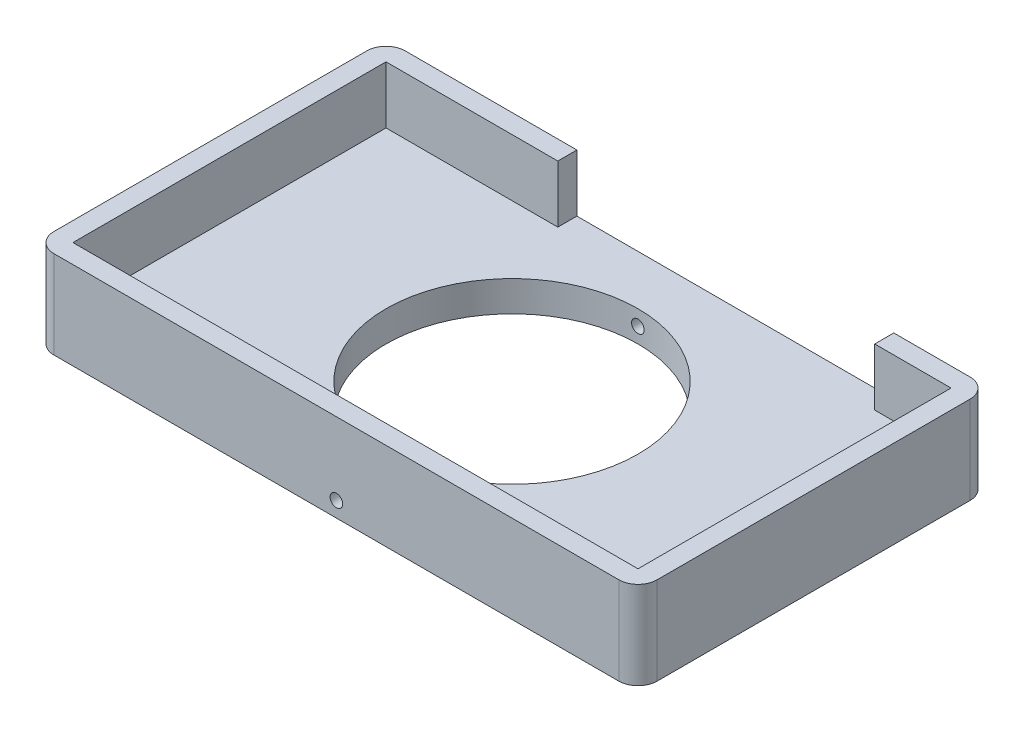
ISO-10303-21;
HEADER;
FILE_DESCRIPTION(('STEP AP214'),'2;1');
FILE_NAME('part.step','',(''),(''),'','','');
FILE_SCHEMA(('AUTOMOTIVE_DESIGN { 1 0 10303 214 1 1 1 1 }'));
ENDSEC;
DATA;
#1=APPLICATION_CONTEXT('core data for automotive mechanical design processes');
#2=APPLICATION_PROTOCOL_DEFINITION('international standard','automotive_design',2000,#1);
#3=PRODUCT_CONTEXT('',#1,'mechanical');
#4=PRODUCT('Part','Part','',(#3));
#5=PRODUCT_RELATED_PRODUCT_CATEGORY('part','',(#4));
#6=PRODUCT_DEFINITION_FORMATION('','',#4);
#7=PRODUCT_DEFINITION_CONTEXT('part definition',#1,'design');
#8=PRODUCT_DEFINITION('design','',#6,#7);
#9=PRODUCT_DEFINITION_SHAPE('','',#8);
#10=(LENGTH_UNIT() NAMED_UNIT(*) SI_UNIT(.MILLI.,.METRE.));
#11=(NAMED_UNIT(*) PLANE_ANGLE_UNIT() SI_UNIT($,.RADIAN.));
#12=(NAMED_UNIT(*) SI_UNIT($,.STERADIAN.) SOLID_ANGLE_UNIT());
#13=UNCERTAINTY_MEASURE_WITH_UNIT(LENGTH_MEASURE(1.E-05),#10,'distance_accuracy_value','');
#14=(GEOMETRIC_REPRESENTATION_CONTEXT(3) GLOBAL_UNCERTAINTY_ASSIGNED_CONTEXT((#13)) GLOBAL_UNIT_ASSIGNED_CONTEXT((#10,
#11,#12)) REPRESENTATION_CONTEXT('',''));
#15=CARTESIAN_POINT('',(0.,0.,0.));
#16=DIRECTION('',(0.,0.,1.));
#17=DIRECTION('',(1.,0.,0.));
#18=AXIS2_PLACEMENT_3D('',#15,#16,#17);
#19=CARTESIAN_POINT('',(-78.9999999999999,8.,46.));
#20=DIRECTION('',(0.,0.,-1.));
#21=DIRECTION('',(-1.,0.,0.));
#22=AXIS2_PLACEMENT_3D('',#19,#20,#21);
#23=PLANE('',#22);
#24=CARTESIAN_POINT('',(0.,4.,46.));
#25=DIRECTION('',(0.,0.,1.));
#26=DIRECTION('',(1.,0.,0.));
#27=AXIS2_PLACEMENT_3D('',#24,#25,#26);
#28=CIRCLE('',#27,1.64999999999999);
#29=CARTESIAN_POINT('',(1.64999999999999,4.,46.));
#30=VERTEX_POINT('',#29);
#31=EDGE_CURVE('E382',#30,#30,#28,.T.);
#32=ORIENTED_EDGE('',*,*,#31,.F.);
#33=EDGE_LOOP('',(#32));
#34=FACE_BOUND('',#33,.T.);
#35=DIRECTION('',(1.,0.,0.));
#36=VECTOR('',#35,1.);
#37=CARTESIAN_POINT('',(-79.,23.,46.));
#38=LINE('',#37,#36);
#39=CARTESIAN_POINT('',(-73.9999999999999,23.,46.));
#40=VERTEX_POINT('',#39);
#41=CARTESIAN_POINT('',(74.0000000000001,23.,46.));
#42=VERTEX_POINT('',#41);
#43=EDGE_CURVE('E11',#40,#42,#38,.T.);
#44=ORIENTED_EDGE('',*,*,#43,.F.);
#45=DIRECTION('',(0.,-1.,0.));
#46=VECTOR('',#45,1.);
#47=CARTESIAN_POINT('',(-73.9999999999999,8.,46.));
#48=LINE('',#47,#46);
#49=CARTESIAN_POINT('',(-73.9999999999999,0.,46.));
#50=VERTEX_POINT('',#49);
#51=EDGE_CURVE('E224',#40,#50,#48,.T.);
#52=ORIENTED_EDGE('',*,*,#51,.T.);
#53=DIRECTION('',(1.,0.,0.));
#54=VECTOR('',#53,1.);
#55=CARTESIAN_POINT('',(-78.9999999999999,0.,46.));
#56=LINE('',#55,#54);
#57=CARTESIAN_POINT('',(74.,0.,46.));
#58=VERTEX_POINT('',#57);
#59=EDGE_CURVE('E269',#50,#58,#56,.T.);
#60=ORIENTED_EDGE('',*,*,#59,.T.);
#61=DIRECTION('',(0.,-1.,0.));
#62=VECTOR('',#61,1.);
#63=CARTESIAN_POINT('',(74.,8.,46.));
#64=LINE('',#63,#62);
#65=EDGE_CURVE('E258',#58,#42,#64,.F.);
#66=ORIENTED_EDGE('',*,*,#65,.T.);
#67=EDGE_LOOP('',(#44,#52,#60,#66));
#68=FACE_BOUND('',#67,.T.);
#69=ADVANCED_FACE('F37',(#34,#68),#23,.F.);
#70=CARTESIAN_POINT('',(0.,23.,0.));
#71=DIRECTION('',(0.,1.,0.));
#72=DIRECTION('',(0.,0.,1.));
#73=AXIS2_PLACEMENT_3D('',#70,#71,#72);
#74=PLANE('',#73);
#75=DIRECTION('',(1.,0.,0.));
#76=VECTOR('',#75,1.);
#77=CARTESIAN_POINT('',(-74.,23.,41.));
#78=LINE('',#77,#76);
#79=CARTESIAN_POINT('',(-74.,23.,41.));
#80=VERTEX_POINT('',#79);
#81=CARTESIAN_POINT('',(74.,23.,41.));
#82=VERTEX_POINT('',#81);
#83=EDGE_CURVE('E49',#80,#82,#78,.T.);
#84=ORIENTED_EDGE('',*,*,#83,.F.);
#85=DIRECTION('',(0.,0.,1.));
#86=VECTOR('',#85,1.);
#87=CARTESIAN_POINT('',(-74.,23.,-41.));
#88=LINE('',#87,#86);
#89=CARTESIAN_POINT('',(-74.,23.,-41.));
#90=VERTEX_POINT('',#89);
#91=EDGE_CURVE('E237',#90,#80,#88,.T.);
#92=ORIENTED_EDGE('',*,*,#91,.F.);
#93=DIRECTION('',(-1.,0.,0.));
#94=VECTOR('',#93,1.);
#95=CARTESIAN_POINT('',(-74.,23.,-41.));
#96=LINE('',#95,#94);
#97=CARTESIAN_POINT('',(-29.,23.,-41.));
#98=VERTEX_POINT('',#97);
#99=EDGE_CURVE('E240',#98,#90,#96,.T.);
#100=ORIENTED_EDGE('',*,*,#99,.F.);
#101=DIRECTION('',(0.,0.,-1.));
#102=VECTOR('',#101,1.);
#103=CARTESIAN_POINT('',(-29.,23.,0.));
#104=LINE('',#103,#102);
#105=CARTESIAN_POINT('',(-29.,23.,-46.));
#106=VERTEX_POINT('',#105);
#107=EDGE_CURVE('E215',#98,#106,#104,.T.);
#108=ORIENTED_EDGE('',*,*,#107,.T.);
#109=DIRECTION('',(-1.,0.,0.));
#110=VECTOR('',#109,1.);
#111=CARTESIAN_POINT('',(-79.,23.,-46.));
#112=LINE('',#111,#110);
#113=CARTESIAN_POINT('',(-74.,23.,-46.));
#114=VERTEX_POINT('',#113);
#115=EDGE_CURVE('E230',#106,#114,#112,.T.);
#116=ORIENTED_EDGE('',*,*,#115,.T.);
#117=CARTESIAN_POINT('',(-74.,23.,-41.));
#118=DIRECTION('',(0.,1.,0.));
#119=DIRECTION('',(0.,0.,1.));
#120=AXIS2_PLACEMENT_3D('',#117,#118,#119);
#121=CIRCLE('',#120,5.);
#122=CARTESIAN_POINT('',(-79.,23.,-41.));
#123=VERTEX_POINT('',#122);
#124=EDGE_CURVE('E218',#114,#123,#121,.T.);
#125=ORIENTED_EDGE('',*,*,#124,.T.);
#126=DIRECTION('',(0.,0.,1.));
#127=VECTOR('',#126,1.);
#128=CARTESIAN_POINT('',(-79.,23.,-46.));
#129=LINE('',#128,#127);
#130=CARTESIAN_POINT('',(-79.,23.,41.));
#131=VERTEX_POINT('',#130);
#132=EDGE_CURVE('E227',#123,#131,#129,.T.);
#133=ORIENTED_EDGE('',*,*,#132,.T.);
#134=CARTESIAN_POINT('',(-73.9999999999999,23.,41.));
#135=DIRECTION('',(0.,1.,0.));
#136=DIRECTION('',(0.,0.,1.));
#137=AXIS2_PLACEMENT_3D('',#134,#135,#136);
#138=CIRCLE('',#137,5.);
#139=EDGE_CURVE('E220',#131,#40,#138,.T.);
#140=ORIENTED_EDGE('',*,*,#139,.T.);
#141=ORIENTED_EDGE('',*,*,#43,.T.);
#142=CARTESIAN_POINT('',(74.,23.,41.));
#143=DIRECTION('',(0.,1.,0.));
#144=DIRECTION('',(0.,0.,1.));
#145=AXIS2_PLACEMENT_3D('',#142,#143,#144);
#146=CIRCLE('',#145,5.);
#147=CARTESIAN_POINT('',(79.,23.,41.));
#148=VERTEX_POINT('',#147);
#149=EDGE_CURVE('E173',#42,#148,#146,.T.);
#150=ORIENTED_EDGE('',*,*,#149,.T.);
#151=DIRECTION('',(0.,0.,-1.));
#152=VECTOR('',#151,1.);
#153=CARTESIAN_POINT('',(79.,23.,-46.));
#154=LINE('',#153,#152);
#155=CARTESIAN_POINT('',(79.,23.,-41.));
#156=VERTEX_POINT('',#155);
#157=EDGE_CURVE('E190',#148,#156,#154,.T.);
#158=ORIENTED_EDGE('',*,*,#157,.T.);
#159=CARTESIAN_POINT('',(74.,23.,-41.));
#160=DIRECTION('',(0.,1.,0.));
#161=DIRECTION('',(0.,0.,1.));
#162=AXIS2_PLACEMENT_3D('',#159,#160,#161);
#163=CIRCLE('',#162,5.);
#164=CARTESIAN_POINT('',(74.,23.,-46.));
#165=VERTEX_POINT('',#164);
#166=EDGE_CURVE('E193',#156,#165,#163,.T.);
#167=ORIENTED_EDGE('',*,*,#166,.T.);
#168=DIRECTION('',(-1.,0.,0.));
#169=VECTOR('',#168,1.);
#170=CARTESIAN_POINT('',(-79.,23.,-46.));
#171=LINE('',#170,#169);
#172=CARTESIAN_POINT('',(54.,23.,-46.));
#173=VERTEX_POINT('',#172);
#174=EDGE_CURVE('E187',#165,#173,#171,.T.);
#175=ORIENTED_EDGE('',*,*,#174,.T.);
#176=DIRECTION('',(0.,0.,-1.));
#177=VECTOR('',#176,1.);
#178=CARTESIAN_POINT('',(54.,23.,0.));
#179=LINE('',#178,#177);
#180=CARTESIAN_POINT('',(54.,23.,-41.));
#181=VERTEX_POINT('',#180);
#182=EDGE_CURVE('E178',#181,#173,#179,.T.);
#183=ORIENTED_EDGE('',*,*,#182,.F.);
#184=DIRECTION('',(-1.,0.,0.));
#185=VECTOR('',#184,1.);
#186=CARTESIAN_POINT('',(-74.,23.,-41.));
#187=LINE('',#186,#185);
#188=CARTESIAN_POINT('',(74.,23.,-41.));
#189=VERTEX_POINT('',#188);
#190=EDGE_CURVE('E170',#189,#181,#187,.T.);
#191=ORIENTED_EDGE('',*,*,#190,.F.);
#192=DIRECTION('',(0.,0.,-1.));
#193=VECTOR('',#192,1.);
#194=CARTESIAN_POINT('',(74.,23.,-41.));
#195=LINE('',#194,#193);
#196=EDGE_CURVE('E157',#82,#189,#195,.T.);
#197=ORIENTED_EDGE('',*,*,#196,.F.);
#198=EDGE_LOOP('',(#84,#92,#100,#108,#116,#125,#133,#140,#141,#150,#158,#167,#175,#183,#191,#197));
#199=FACE_BOUND('',#198,.T.);
#200=ADVANCED_FACE('F175',(#199),#74,.T.);
#201=CARTESIAN_POINT('',(-74.,23.,41.));
#202=DIRECTION('',(0.,0.,-1.));
#203=DIRECTION('',(-1.,0.,0.));
#204=AXIS2_PLACEMENT_3D('',#201,#202,#203);
#205=PLANE('',#204);
#206=DIRECTION('',(0.,-1.,0.));
#207=VECTOR('',#206,1.);
#208=CARTESIAN_POINT('',(74.,23.,41.));
#209=LINE('',#208,#207);
#210=CARTESIAN_POINT('',(74.,8.,41.));
#211=VERTEX_POINT('',#210);
#212=EDGE_CURVE('E164',#82,#211,#209,.T.);
#213=ORIENTED_EDGE('',*,*,#212,.T.);
#214=DIRECTION('',(1.,0.,0.));
#215=VECTOR('',#214,1.);
#216=CARTESIAN_POINT('',(-74.,8.,41.));
#217=LINE('',#216,#215);
#218=CARTESIAN_POINT('',(-74.,8.,41.));
#219=VERTEX_POINT('',#218);
#220=EDGE_CURVE('E203',#219,#211,#217,.T.);
#221=ORIENTED_EDGE('',*,*,#220,.F.);
#222=DIRECTION('',(0.,-1.,0.));
#223=VECTOR('',#222,1.);
#224=CARTESIAN_POINT('',(-74.,23.,41.));
#225=LINE('',#224,#223);
#226=EDGE_CURVE('E234',#80,#219,#225,.T.);
#227=ORIENTED_EDGE('',*,*,#226,.F.);
#228=ORIENTED_EDGE('',*,*,#83,.T.);
#229=EDGE_LOOP('',(#213,#221,#227,#228));
#230=FACE_BOUND('',#229,.T.);
#231=ADVANCED_FACE('F330',(#230),#205,.T.);
#232=CARTESIAN_POINT('',(74.,8.,-41.));
#233=DIRECTION('',(0.,1.,0.));
#234=DIRECTION('',(0.,0.,1.));
#235=AXIS2_PLACEMENT_3D('',#232,#233,#234);
#236=PLANE('',#235);
#237=DIRECTION('',(0.,0.,1.));
#238=VECTOR('',#237,1.);
#239=CARTESIAN_POINT('',(-29.,8.,46.01));
#240=LINE('',#239,#238);
#241=CARTESIAN_POINT('',(-29.,8.,-46.));
#242=VERTEX_POINT('',#241);
#243=CARTESIAN_POINT('',(-29.,8.,-41.));
#244=VERTEX_POINT('',#243);
#245=EDGE_CURVE('E250',#242,#244,#240,.T.);
#246=ORIENTED_EDGE('',*,*,#245,.T.);
#247=DIRECTION('',(-1.,0.,0.));
#248=VECTOR('',#247,1.);
#249=CARTESIAN_POINT('',(-74.,8.,-41.));
#250=LINE('',#249,#248);
#251=CARTESIAN_POINT('',(-74.,8.,-41.));
#252=VERTEX_POINT('',#251);
#253=EDGE_CURVE('E207',#244,#252,#250,.T.);
#254=ORIENTED_EDGE('',*,*,#253,.T.);
#255=DIRECTION('',(0.,0.,1.));
#256=VECTOR('',#255,1.);
#257=CARTESIAN_POINT('',(-74.,8.,-41.));
#258=LINE('',#257,#256);
#259=EDGE_CURVE('E204',#252,#219,#258,.T.);
#260=ORIENTED_EDGE('',*,*,#259,.T.);
#261=ORIENTED_EDGE('',*,*,#220,.T.);
#262=DIRECTION('',(0.,0.,-1.));
#263=VECTOR('',#262,1.);
#264=CARTESIAN_POINT('',(74.,8.,-41.));
#265=LINE('',#264,#263);
#266=CARTESIAN_POINT('',(74.,8.,-41.));
#267=VERTEX_POINT('',#266);
#268=EDGE_CURVE('E275',#211,#267,#265,.T.);
#269=ORIENTED_EDGE('',*,*,#268,.T.);
#270=DIRECTION('',(-1.,0.,0.));
#271=VECTOR('',#270,1.);
#272=CARTESIAN_POINT('',(-74.,8.,-41.));
#273=LINE('',#272,#271);
#274=CARTESIAN_POINT('',(54.,8.,-41.));
#275=VERTEX_POINT('',#274);
#276=EDGE_CURVE('E172',#267,#275,#273,.T.);
#277=ORIENTED_EDGE('',*,*,#276,.T.);
#278=DIRECTION('',(0.,0.,1.));
#279=VECTOR('',#278,1.);
#280=CARTESIAN_POINT('',(54.,8.,46.01));
#281=LINE('',#280,#279);
#282=CARTESIAN_POINT('',(54.,8.,-46.));
#283=VERTEX_POINT('',#282);
#284=EDGE_CURVE('E167',#283,#275,#281,.T.);
#285=ORIENTED_EDGE('',*,*,#284,.F.);
#286=DIRECTION('',(-1.,0.,0.));
#287=VECTOR('',#286,1.);
#288=CARTESIAN_POINT('',(-79.,8.,-46.));
#289=LINE('',#288,#287);
#290=EDGE_CURVE('E252',#283,#242,#289,.T.);
#291=ORIENTED_EDGE('',*,*,#290,.T.);
#292=EDGE_LOOP('',(#246,#254,#260,#261,#269,#277,#285,#291));
#293=FACE_BOUND('',#292,.T.);
#294=CARTESIAN_POINT('',(0.,8.,0.));
#295=DIRECTION('',(0.,1.,0.));
#296=DIRECTION('',(0.,0.,1.));
#297=AXIS2_PLACEMENT_3D('',#294,#295,#296);
#298=CIRCLE('',#297,33.);
#299=CARTESIAN_POINT('',(0.,8.,33.));
#300=VERTEX_POINT('',#299);
#301=EDGE_CURVE('E244',#300,#300,#298,.T.);
#302=ORIENTED_EDGE('',*,*,#301,.F.);
#303=EDGE_LOOP('',(#302));
#304=FACE_BOUND('',#303,.T.);
#305=ADVANCED_FACE('F332',(#293,#304),#236,.T.);
#306=CARTESIAN_POINT('',(0.,0.,0.));
#307=DIRECTION('',(0.,1.,0.));
#308=DIRECTION('',(0.,0.,1.));
#309=AXIS2_PLACEMENT_3D('',#306,#307,#308);
#310=PLANE('',#309);
#311=ORIENTED_EDGE('',*,*,#59,.F.);
#312=CARTESIAN_POINT('',(-73.9999999999999,0.,41.));
#313=DIRECTION('',(0.,1.,0.));
#314=DIRECTION('',(0.,0.,1.));
#315=AXIS2_PLACEMENT_3D('',#312,#313,#314);
#316=CIRCLE('',#315,5.);
#317=CARTESIAN_POINT('',(-78.9999999999999,0.,41.));
#318=VERTEX_POINT('',#317);
#319=EDGE_CURVE('E182',#50,#318,#316,.F.);
#320=ORIENTED_EDGE('',*,*,#319,.T.);
#321=DIRECTION('',(0.,0.,1.));
#322=VECTOR('',#321,1.);
#323=CARTESIAN_POINT('',(-79.,0.,-46.));
#324=LINE('',#323,#322);
#325=CARTESIAN_POINT('',(-79.,0.,-41.));
#326=VERTEX_POINT('',#325);
#327=EDGE_CURVE('E200',#326,#318,#324,.T.);
#328=ORIENTED_EDGE('',*,*,#327,.F.);
#329=CARTESIAN_POINT('',(-74.,0.,-41.));
#330=DIRECTION('',(0.,1.,0.));
#331=DIRECTION('',(0.,0.,1.));
#332=AXIS2_PLACEMENT_3D('',#329,#330,#331);
#333=CIRCLE('',#332,5.);
#334=CARTESIAN_POINT('',(-74.,0.,-46.));
#335=VERTEX_POINT('',#334);
#336=EDGE_CURVE('E179',#326,#335,#333,.F.);
#337=ORIENTED_EDGE('',*,*,#336,.T.);
#338=DIRECTION('',(-1.,0.,0.));
#339=VECTOR('',#338,1.);
#340=CARTESIAN_POINT('',(-79.,0.,-46.));
#341=LINE('',#340,#339);
#342=CARTESIAN_POINT('',(74.,0.,-46.));
#343=VERTEX_POINT('',#342);
#344=EDGE_CURVE('E270',#343,#335,#341,.T.);
#345=ORIENTED_EDGE('',*,*,#344,.F.);
#346=CARTESIAN_POINT('',(74.,0.,-41.));
#347=DIRECTION('',(0.,1.,0.));
#348=DIRECTION('',(0.,0.,1.));
#349=AXIS2_PLACEMENT_3D('',#346,#347,#348);
#350=CIRCLE('',#349,5.);
#351=CARTESIAN_POINT('',(79.,0.,-41.));
#352=VERTEX_POINT('',#351);
#353=EDGE_CURVE('E265',#343,#352,#350,.F.);
#354=ORIENTED_EDGE('',*,*,#353,.T.);
#355=DIRECTION('',(0.,0.,-1.));
#356=VECTOR('',#355,1.);
#357=CARTESIAN_POINT('',(79.,0.,-46.));
#358=LINE('',#357,#356);
#359=CARTESIAN_POINT('',(79.,0.,41.));
#360=VERTEX_POINT('',#359);
#361=EDGE_CURVE('E272',#360,#352,#358,.T.);
#362=ORIENTED_EDGE('',*,*,#361,.F.);
#363=CARTESIAN_POINT('',(74.,0.,41.));
#364=DIRECTION('',(0.,1.,0.));
#365=DIRECTION('',(0.,0.,1.));
#366=AXIS2_PLACEMENT_3D('',#363,#364,#365);
#367=CIRCLE('',#366,5.);
#368=EDGE_CURVE('E261',#360,#58,#367,.F.);
#369=ORIENTED_EDGE('',*,*,#368,.T.);
#370=EDGE_LOOP('',(#311,#320,#328,#337,#345,#354,#362,#369));
#371=FACE_BOUND('',#370,.T.);
#372=CARTESIAN_POINT('',(0.,0.,0.));
#373=DIRECTION('',(0.,-1.,0.));
#374=DIRECTION('',(0.,0.,-1.));
#375=AXIS2_PLACEMENT_3D('',#372,#373,#374);
#376=CIRCLE('',#375,33.);
#377=CARTESIAN_POINT('',(0.,0.,-33.));
#378=VERTEX_POINT('',#377);
#379=EDGE_CURVE('E253',#378,#378,#376,.T.);
#380=ORIENTED_EDGE('',*,*,#379,.F.);
#381=EDGE_LOOP('',(#380));
#382=FACE_BOUND('',#381,.T.);
#383=ADVANCED_FACE('F339',(#371,#382),#310,.F.);
#384=CARTESIAN_POINT('',(79.,8.,-46.));
#385=DIRECTION('',(-1.,0.,0.));
#386=DIRECTION('',(0.,0.,1.));
#387=AXIS2_PLACEMENT_3D('',#384,#385,#386);
#388=PLANE('',#387);
#389=DIRECTION('',(0.,-1.,0.));
#390=VECTOR('',#389,1.);
#391=CARTESIAN_POINT('',(79.,8.,-41.));
#392=LINE('',#391,#390);
#393=EDGE_CURVE('E267',#352,#156,#392,.F.);
#394=ORIENTED_EDGE('',*,*,#393,.T.);
#395=ORIENTED_EDGE('',*,*,#157,.F.);
#396=DIRECTION('',(0.,-1.,0.));
#397=VECTOR('',#396,1.);
#398=CARTESIAN_POINT('',(79.,8.,41.));
#399=LINE('',#398,#397);
#400=EDGE_CURVE('E65',#148,#360,#399,.T.);
#401=ORIENTED_EDGE('',*,*,#400,.T.);
#402=ORIENTED_EDGE('',*,*,#361,.T.);
#403=EDGE_LOOP('',(#394,#395,#401,#402));
#404=FACE_BOUND('',#403,.T.);
#405=ADVANCED_FACE('F354',(#404),#388,.F.);
#406=CARTESIAN_POINT('',(-79.,8.,-46.));
#407=DIRECTION('',(0.,0.,1.));
#408=DIRECTION('',(1.,0.,0.));
#409=AXIS2_PLACEMENT_3D('',#406,#407,#408);
#410=PLANE('',#409);
#411=CARTESIAN_POINT('',(0.,4.,-46.));
#412=DIRECTION('',(0.,0.,1.));
#413=DIRECTION('',(1.,0.,0.));
#414=AXIS2_PLACEMENT_3D('',#411,#412,#413);
#415=CIRCLE('',#414,1.64999999999999);
#416=CARTESIAN_POINT('',(1.64999999999999,4.,-46.));
#417=VERTEX_POINT('',#416);
#418=EDGE_CURVE('E285',#417,#417,#415,.T.);
#419=ORIENTED_EDGE('',*,*,#418,.T.);
#420=EDGE_LOOP('',(#419));
#421=FACE_BOUND('',#420,.T.);
#422=ORIENTED_EDGE('',*,*,#290,.F.);
#423=DIRECTION('',(0.,1.,0.));
#424=VECTOR('',#423,1.);
#425=CARTESIAN_POINT('',(54.,8.,-46.));
#426=LINE('',#425,#424);
#427=EDGE_CURVE('E184',#283,#173,#426,.T.);
#428=ORIENTED_EDGE('',*,*,#427,.T.);
#429=ORIENTED_EDGE('',*,*,#174,.F.);
#430=DIRECTION('',(0.,-1.,0.));
#431=VECTOR('',#430,1.);
#432=CARTESIAN_POINT('',(74.,8.,-46.));
#433=LINE('',#432,#431);
#434=EDGE_CURVE('E262',#165,#343,#433,.T.);
#435=ORIENTED_EDGE('',*,*,#434,.T.);
#436=ORIENTED_EDGE('',*,*,#344,.T.);
#437=DIRECTION('',(0.,-1.,0.));
#438=VECTOR('',#437,1.);
#439=CARTESIAN_POINT('',(-74.,8.,-46.));
#440=LINE('',#439,#438);
#441=EDGE_CURVE('E217',#335,#114,#440,.F.);
#442=ORIENTED_EDGE('',*,*,#441,.T.);
#443=ORIENTED_EDGE('',*,*,#115,.F.);
#444=DIRECTION('',(0.,1.,0.));
#445=VECTOR('',#444,1.);
#446=CARTESIAN_POINT('',(-29.,8.,-46.));
#447=LINE('',#446,#445);
#448=EDGE_CURVE('E211',#242,#106,#447,.T.);
#449=ORIENTED_EDGE('',*,*,#448,.F.);
#450=EDGE_LOOP('',(#422,#428,#429,#435,#436,#442,#443,#449));
#451=FACE_BOUND('',#450,.T.);
#452=ADVANCED_FACE('F350',(#421,#451),#410,.F.);
#453=CARTESIAN_POINT('',(74.,8.,-41.));
#454=DIRECTION('',(0.,-1.,0.));
#455=DIRECTION('',(0.,0.,-1.));
#456=AXIS2_PLACEMENT_3D('',#453,#454,#455);
#457=CYLINDRICAL_SURFACE('',#456,5.);
#458=ORIENTED_EDGE('',*,*,#434,.F.);
#459=ORIENTED_EDGE('',*,*,#166,.F.);
#460=ORIENTED_EDGE('',*,*,#393,.F.);
#461=ORIENTED_EDGE('',*,*,#353,.F.);
#462=EDGE_LOOP('',(#458,#459,#460,#461));
#463=FACE_BOUND('',#462,.T.);
#464=ADVANCED_FACE('F346',(#463),#457,.T.);
#465=CARTESIAN_POINT('',(74.,8.,41.));
#466=DIRECTION('',(0.,-1.,0.));
#467=DIRECTION('',(0.,0.,-1.));
#468=AXIS2_PLACEMENT_3D('',#465,#466,#467);
#469=CYLINDRICAL_SURFACE('',#468,5.);
#470=ORIENTED_EDGE('',*,*,#400,.F.);
#471=ORIENTED_EDGE('',*,*,#149,.F.);
#472=ORIENTED_EDGE('',*,*,#65,.F.);
#473=ORIENTED_EDGE('',*,*,#368,.F.);
#474=EDGE_LOOP('',(#470,#471,#472,#473));
#475=FACE_BOUND('',#474,.T.);
#476=ADVANCED_FACE('F342',(#475),#469,.T.);
#477=CARTESIAN_POINT('',(0.,23.,0.));
#478=DIRECTION('',(0.,-1.,0.));
#479=DIRECTION('',(0.,0.,-1.));
#480=AXIS2_PLACEMENT_3D('',#477,#478,#479);
#481=CYLINDRICAL_SURFACE('',#480,33.);
#482=CARTESIAN_POINT('',(0.,5.64999999999999,-33.));
#483=CARTESIAN_POINT('',(0.0926191339516156,5.64999591244356,-32.9999994481235));
#484=CARTESIAN_POINT('',(0.185303950535038,5.64217534991027,-32.9996059010118));
#485=CARTESIAN_POINT('',(0.368116738250328,5.61108848426821,-32.9980737975902));
#486=CARTESIAN_POINT('',(0.458241566209655,5.58780398252466,-32.9969343635108));
#487=CARTESIAN_POINT('',(0.633259701322046,5.52645756542433,-32.9940394509726));
#488=CARTESIAN_POINT('',(0.71815564910883,5.48840318108441,-32.9922842865124));
#489=CARTESIAN_POINT('',(0.880331715106629,5.39860879433575,-32.9883555871818));
#490=CARTESIAN_POINT('',(0.957613625223116,5.34687202258264,-32.9861821511057));
#491=CARTESIAN_POINT('',(1.1024689382403,5.23112329113805,-32.9816589523635));
#492=CARTESIAN_POINT('',(1.17003370119341,5.1671005240325,-32.9793090355716));
#493=CARTESIAN_POINT('',(1.29346318015331,5.02861874664454,-32.9746990543606));
#494=CARTESIAN_POINT('',(1.34932741821446,4.95415931025005,-32.9724389936151));
#495=CARTESIAN_POINT('',(1.44779388417608,4.79687250607558,-32.9682624921126));
#496=CARTESIAN_POINT('',(1.49038936557226,4.71404090972314,-32.9663462263675));
#497=CARTESIAN_POINT('',(1.5610659052694,4.54239083536068,-32.9630752843664));
#498=CARTESIAN_POINT('',(1.58914707371536,4.45357240278884,-32.9617206038488));
#499=CARTESIAN_POINT('',(1.6299750415114,4.27254935932247,-32.9597269894798));
#500=CARTESIAN_POINT('',(1.64273476716062,4.18034767057822,-32.9590874523122));
#501=CARTESIAN_POINT('',(1.65259752960763,3.9951090302844,-32.9585944325064));
#502=CARTESIAN_POINT('',(1.64970068996059,3.90207208533212,-32.9587409436652));
#503=CARTESIAN_POINT('',(1.62834332102027,3.7178917732163,-32.9598029379067));
#504=CARTESIAN_POINT('',(1.60989675852382,3.62674678194637,-32.9607177309142));
#505=CARTESIAN_POINT('',(1.55798521788353,3.44884866183701,-32.9632120957861));
#506=CARTESIAN_POINT('',(1.52452017627751,3.36209555155766,-32.9647916704595));
#507=CARTESIAN_POINT('',(1.44350567711269,3.19539880359695,-32.9684383621007));
#508=CARTESIAN_POINT('',(1.39594985198883,3.11545826556262,-32.9705056994));
#509=CARTESIAN_POINT('',(1.28810836089487,2.96468978445445,-32.9748946824163));
#510=CARTESIAN_POINT('',(1.22782260508705,2.89386190569619,-32.977216329928));
#511=CARTESIAN_POINT('',(1.09615372672471,2.76324799459258,-32.9818553281202));
#512=CARTESIAN_POINT('',(1.02475850925648,2.7034741539041,-32.9841726712985));
#513=CARTESIAN_POINT('',(0.872939863318958,2.59675902528999,-32.9885394215882));
#514=CARTESIAN_POINT('',(0.792516432628954,2.54981774052086,-32.9905888286336));
#515=CARTESIAN_POINT('',(0.624917155791944,2.47010138433185,-32.9941888251703));
#516=CARTESIAN_POINT('',(0.537741106961338,2.43732673832599,-32.9957393996818));
#517=CARTESIAN_POINT('',(0.359114366901218,2.38688198090558,-32.9981667603576));
#518=CARTESIAN_POINT('',(0.267663707677968,2.36921175641536,-32.9990435515661));
#519=CARTESIAN_POINT('',(0.0831895361896255,2.34949246123986,-33.000023881358));
#520=CARTESIAN_POINT('',(-0.00983216925021863,2.34742652732856,-33.0001282546746));
#521=CARTESIAN_POINT('',(-0.194900926715822,2.35893045020888,-32.9995542018301));
#522=CARTESIAN_POINT('',(-0.286947981964039,2.37250025528821,-32.998875778258));
#523=CARTESIAN_POINT('',(-0.467407306100799,2.41487650171326,-32.9968130816713));
#524=CARTESIAN_POINT('',(-0.55582138748969,2.44367524334227,-32.995429165365));
#525=CARTESIAN_POINT('',(-0.726560844071986,2.5156840655901,-32.9921112935293));
#526=CARTESIAN_POINT('',(-0.808886184213604,2.558894229165,-32.9901773348337));
#527=CARTESIAN_POINT('',(-0.965188672629306,2.6585424905797,-32.9859748599013));
#528=CARTESIAN_POINT('',(-1.03915860643782,2.71499189240585,-32.9837060583846));
#529=CARTESIAN_POINT('',(-1.17657800727757,2.83949972309775,-32.9790903594782));
#530=CARTESIAN_POINT('',(-1.24002740681002,2.90755822644074,-32.9767434615876));
#531=CARTESIAN_POINT('',(-1.35466141487621,3.05342487191937,-32.9722337097007));
#532=CARTESIAN_POINT('',(-1.40583511272871,3.1312415943507,-32.9700710205226));
#533=CARTESIAN_POINT('',(-1.49439051173929,3.29437238971171,-32.9661761530703));
#534=CARTESIAN_POINT('',(-1.53177227292112,3.37968643001039,-32.9644439729226));
#535=CARTESIAN_POINT('',(-1.59166364436845,3.55534968678995,-32.9616066297395));
#536=CARTESIAN_POINT('',(-1.61418021023616,3.64569652687351,-32.9605011734868));
#537=CARTESIAN_POINT('',(-1.6437247779819,3.82889402541432,-32.9590411117993));
#538=CARTESIAN_POINT('',(-1.65075286779476,3.92174466965333,-32.9586865021016));
#539=CARTESIAN_POINT('',(-1.64912014479054,4.1072054760096,-32.9587682280492));
#540=CARTESIAN_POINT('',(-1.64047649648883,4.19981579010933,-32.9592036983574));
#541=CARTESIAN_POINT('',(-1.60778113925583,4.38226868127476,-32.9608146749974));
#542=CARTESIAN_POINT('',(-1.58372940095916,4.47211125306523,-32.9619901827397));
#543=CARTESIAN_POINT('',(-1.52090410891888,4.64648195688402,-32.9649485507496));
#544=CARTESIAN_POINT('',(-1.48213044713416,4.73101004990518,-32.9667314154745));
#545=CARTESIAN_POINT('',(-1.39096491528367,4.89235775760585,-32.9707034986418));
#546=CARTESIAN_POINT('',(-1.33857346305851,4.96917760870048,-32.9728927046155));
#547=CARTESIAN_POINT('',(-1.22159809802661,5.11301392594913,-32.9774334626002));
#548=CARTESIAN_POINT('',(-1.1570022210015,5.18002065672713,-32.9797851724696));
#549=CARTESIAN_POINT('',(-1.01745949783203,5.3022597934191,-32.9843847702225));
#550=CARTESIAN_POINT('',(-0.942510109142566,5.3574892986617,-32.9866326324224));
#551=CARTESIAN_POINT('',(-0.784329069660819,5.45463204751371,-32.9907727913162));
#552=CARTESIAN_POINT('',(-0.701089551902479,5.49653248123899,-32.9926647452559));
#553=CARTESIAN_POINT('',(-0.528809939688449,5.56571298159351,-32.9958747696858));
#554=CARTESIAN_POINT('',(-0.43977683687733,5.59301031712073,-32.9971935176732));
#555=CARTESIAN_POINT('',(-0.291825477930051,5.6250496050241,-32.9987597283397));
#556=CARTESIAN_POINT('',(-0.233865526633966,5.63439405784821,-32.9992227861963));
#557=CARTESIAN_POINT('',(-0.117279163384286,5.64687054694547,-32.9998430966389));
#558=CARTESIAN_POINT('',(-0.0586527519994037,5.65000258851948,-33.0000003494858));
#559=CARTESIAN_POINT('',(0.,5.64999999999999,-33.));
#560=B_SPLINE_CURVE_WITH_KNOTS('',3,(#482,#483,#484,#485,#486,#487,#488,#489,#490,#491,#492,
#493,#494,#495,#496,#497,#498,#499,#500,#501,#502,#503,#504,#505,#506,#507,#508,#509,#510,#511,
#512,#513,#514,#515,#516,#517,#518,#519,#520,#521,#522,#523,#524,#525,#526,#527,#528,#529,#530,
#531,#532,#533,#534,#535,#536,#537,#538,#539,#540,#541,#542,#543,#544,#545,#546,#547,#548,#549,
#550,#551,#552,#553,#554,#555,#556,#557,#558,#559),.UNSPECIFIED.,.T.,.F.,(4,2,2,2,2,2,2,2,2,2,2,
2,2,2,2,2,2,2,2,2,2,2,2,2,2,2,2,2,2,2,2,2,2,2,2,2,2,2,4),(0.,0.277643297422005,
0.555613917890647,0.833442989699423,1.11120651958985,1.38921551442524,1.66723586322017,
1.9453973417003,2.22355670926084,2.50148123580564,2.77940356908752,3.05707653755259,
3.33475067936553,3.61255049281215,3.89035226681434,4.1684586285061,4.44656505860521,
4.72467983946103,5.0027925382582,5.28060464349707,5.5584158299269,5.83608668974141,
6.11375914793266,6.39166955838207,6.66958175180995,6.94774004675732,7.22589713112055,
7.50392397004529,7.78194923048645,8.05967016690335,8.33739163261408,8.61511513650373,
8.89283011988721,9.17081877832869,9.44887582509918,9.72719929646593,10.0051929046734,
10.1810157251675,10.3568383956375),.UNSPECIFIED.);
#561=CARTESIAN_POINT('',(0.,5.64999999999999,-33.));
#562=VERTEX_POINT('',#561);
#563=EDGE_CURVE('E40',#562,#562,#560,.T.);
#564=ORIENTED_EDGE('',*,*,#563,.T.);
#565=EDGE_LOOP('',(#564));
#566=FACE_BOUND('',#565,.T.);
#567=CARTESIAN_POINT('',(1.64999999999999,4.,32.958724186473));
#568=CARTESIAN_POINT('',(1.64999591236943,4.09261905234454,32.9587247409378));
#569=CARTESIAN_POINT('',(1.64217536315125,4.18530378759889,32.9591187932688));
#570=CARTESIAN_POINT('',(1.61108855520966,4.36811640632438,32.9606527016132));
#571=CARTESIAN_POINT('',(1.5878040975751,4.45824114655932,32.9617934363472));
#572=CARTESIAN_POINT('',(1.52645780952765,4.63325909623851,32.9646911717318));
#573=CARTESIAN_POINT('',(1.4884035122361,4.71815494705961,32.9664478581821));
#574=CARTESIAN_POINT('',(1.39860933043149,4.88033085082796,32.9703791571665));
#575=CARTESIAN_POINT('',(1.346872676358,4.9576126955578,32.9725536710174));
#576=CARTESIAN_POINT('',(1.23112406337547,5.10246808339365,32.9770781156334));
#577=CARTESIAN_POINT('',(1.16710127080228,5.17003296560604,32.9794282000878));
#578=CARTESIAN_POINT('',(1.02861939253843,5.29346267445629,32.9840375273585));
#579=CARTESIAN_POINT('',(0.954159881059475,5.3493270235138,32.9862967664638));
#580=CARTESIAN_POINT('',(0.796873012077624,5.44779360477709,32.9904709915826));
#581=CARTESIAN_POINT('',(0.714041438905007,5.49038911107845,32.9923858028005));
#582=CARTESIAN_POINT('',(0.542391414947647,5.56106570322921,32.9956538444383));
#583=CARTESIAN_POINT('',(0.453573009476512,5.58914689892173,32.9970070791083));
#584=CARTESIAN_POINT('',(0.272550045007796,5.62997492479065,32.9989984464009));
#585=CARTESIAN_POINT('',(0.180348408601422,5.64273468325989,32.9996371818898));
#586=CARTESIAN_POINT('',(-0.0048901295102319,5.65259752947676,33.0001295933978));
#587=CARTESIAN_POINT('',(-0.097927024636722,5.64970074043303,32.9999832755949));
#588=CARTESIAN_POINT('',(-0.2821075621536,5.6283434507778,32.998922576813));
#589=CARTESIAN_POINT('',(-0.373252822709966,5.60989686604719,32.9980088825801));
#590=CARTESIAN_POINT('',(-0.551151469940609,5.5579851872701,32.9955171385745));
#591=CARTESIAN_POINT('',(-0.637904838199804,5.52452003025697,32.9939390860164));
#592=CARTESIAN_POINT('',(-0.804601895646932,5.44350529385923,32.9902952001491));
#593=CARTESIAN_POINT('',(-0.884542498432198,5.39594937412097,32.9882291473418));
#594=CARTESIAN_POINT('',(-1.03531106875195,5.28810768201104,32.9838419303873));
#595=CARTESIAN_POINT('',(-1.10613897192841,5.22782181974267,32.9815207644387));
#596=CARTESIAN_POINT('',(-1.23675275967749,5.09615286688448,32.9768817204739));
#597=CARTESIAN_POINT('',(-1.29652647417589,5.02475770285312,32.9745638488368));
#598=CARTESIAN_POINT('',(-1.40324137379693,4.87293920841908,32.9701952573698));
#599=CARTESIAN_POINT('',(-1.45018255550984,4.79251587561752,32.9681445376108));
#600=CARTESIAN_POINT('',(-1.52989883793195,4.62491662311575,32.9645417028951));
#601=CARTESIAN_POINT('',(-1.56267348102558,4.53774048538986,32.9629896040456));
#602=CARTESIAN_POINT('',(-1.61311820528507,4.35911355243467,32.960559657032));
#603=CARTESIAN_POINT('',(-1.63078840005284,4.26766278936067,32.9596818037967));
#604=CARTESIAN_POINT('',(-1.65050758347163,4.08318857305096,32.9587002808993));
#605=CARTESIAN_POINT('',(-1.65257346361214,3.99016692966944,32.958595774101));
#606=CARTESIAN_POINT('',(-1.64106945535038,3.80509830931466,32.95917054376));
#607=CARTESIAN_POINT('',(-1.62749961865514,3.71305132911921,32.9598498176253));
#608=CARTESIAN_POINT('',(-1.58512338433842,3.53259236068011,32.9619148238465));
#609=CARTESIAN_POINT('',(-1.55632471816636,3.44417855245363,32.963300197713));
#610=CARTESIAN_POINT('',(-1.4843161385349,3.27343960871663,32.9666209549134));
#611=CARTESIAN_POINT('',(-1.44110614167847,3.19111450844428,32.9685563414302));
#612=CARTESIAN_POINT('',(-1.3414581225825,3.03481217807288,32.9727610256111));
#613=CARTESIAN_POINT('',(-1.28500875393688,2.96084218948997,32.9750306090642));
#614=CARTESIAN_POINT('',(-1.16050095867227,2.82342266263349,32.9796468767085));
#615=CARTESIAN_POINT('',(-1.09244245783346,2.75997319162509,32.9819935613924));
#616=CARTESIAN_POINT('',(-0.946575780060172,2.64533903677435,32.9865019846764));
#617=CARTESIAN_POINT('',(-0.86875902260054,2.59416526386241,32.9886635576557));
#618=CARTESIAN_POINT('',(-0.705628137894238,2.50560973299218,32.9925557783938));
#619=CARTESIAN_POINT('',(-0.620314043280629,2.46822791500643,32.9942864280282));
#620=CARTESIAN_POINT('',(-0.44465082702009,2.40833650426315,32.9971209659101));
#621=CARTESIAN_POINT('',(-0.354304090157664,2.38581993133754,32.9982251482891));
#622=CARTESIAN_POINT('',(-0.171106808691414,2.35627531447275,32.9996834806043));
#623=CARTESIAN_POINT('',(-0.0782562782174137,2.34924718314512,33.0000376347723));
#624=CARTESIAN_POINT('',(0.1072046055754,2.35087978832672,32.999956016771));
#625=CARTESIAN_POINT('',(0.199815110425812,2.35952340973882,32.9995211063376));
#626=CARTESIAN_POINT('',(0.382268389610194,2.39221878045208,32.9979120164693));
#627=CARTESIAN_POINT('',(0.47211115873045,2.41627055877646,32.996737835642));
#628=CARTESIAN_POINT('',(0.646482246424608,2.47909600167778,32.9937823077395));
#629=CARTESIAN_POINT('',(0.731010525952339,2.5178697744042,32.9920009562041));
#630=CARTESIAN_POINT('',(0.892358560136068,2.60903558560524,32.9880314234055));
#631=CARTESIAN_POINT('',(0.969178551321686,2.66142720603758,32.9858432546316));
#632=CARTESIAN_POINT('',(1.11301485168178,2.77840275242424,32.9813036493929));
#633=CARTESIAN_POINT('',(1.18002145652101,2.8429986043922,32.9789520546608));
#634=CARTESIAN_POINT('',(1.30226035086379,2.98254122614568,32.9743517066753));
#635=CARTESIAN_POINT('',(1.35748973937167,3.05749053874915,32.9721029788672));
#636=CARTESIAN_POINT('',(1.45463236673825,3.21567151997397,32.9679604824138));
#637=CARTESIAN_POINT('',(1.4965327736316,3.29891106910572,32.9660670565364));
#638=CARTESIAN_POINT('',(1.56571321504958,3.4711907485792,32.9628541355203));
#639=CARTESIAN_POINT('',(1.59301051889164,3.56022388710032,32.9615339628142));
#640=CARTESIAN_POINT('',(1.62504971484162,3.70817516085746,32.9599659701582));
#641=CARTESIAN_POINT('',(1.63439412635757,3.76613498475707,32.9595023549894));
#642=CARTESIAN_POINT('',(1.64687056055667,3.88272109259937,32.9588812877157));
#643=CARTESIAN_POINT('',(1.65000258856305,3.94134737597094,32.9587238353485));
#644=CARTESIAN_POINT('',(1.64999999999999,4.,32.958724186473));
#645=B_SPLINE_CURVE_WITH_KNOTS('',3,(#567,#568,#569,#570,#571,#572,#573,#574,#575,#576,#577,
#578,#579,#580,#581,#582,#583,#584,#585,#586,#587,#588,#589,#590,#591,#592,#593,#594,#595,#596,
#597,#598,#599,#600,#601,#602,#603,#604,#605,#606,#607,#608,#609,#610,#611,#612,#613,#614,#615,
#616,#617,#618,#619,#620,#621,#622,#623,#624,#625,#626,#627,#628,#629,#630,#631,#632,#633,#634,
#635,#636,#637,#638,#639,#640,#641,#642,#643,#644),.UNSPECIFIED.,.T.,.F.,(4,2,2,2,2,2,2,2,2,2,2,
2,2,2,2,2,2,2,2,2,2,2,2,2,2,2,2,2,2,2,2,2,2,2,2,2,2,2,4),(0.,0.277643052335972,
0.555613433062665,0.833442225338301,1.11120547999425,1.38921479543956,1.6672354561733,
1.94539681561001,2.22355606991345,2.50148044696423,2.77940263690218,3.05707637140824,
3.33475127009613,3.61255130307587,3.89035329789769,4.16845934050149,4.44656545700073,
4.72468055637039,5.00279356399323,5.28060547430931,5.55841646590909,5.83608655223198,
6.11375824543384,6.39166878404986,6.66958109947765,6.9477395222021,7.22589673426858,
7.50392324094428,7.78194817894279,8.05966966920051,8.33739168258346,8.6151157361839,
8.89283126518549,9.17081959565159,9.44887632205653,9.72719993241854,10.0051936715377,
10.1810161087632,10.3568383953308),.UNSPECIFIED.);
#646=CARTESIAN_POINT('',(1.64999999999999,4.,32.958724186473));
#647=VERTEX_POINT('',#646);
#648=EDGE_CURVE('E281',#647,#647,#645,.T.);
#649=ORIENTED_EDGE('',*,*,#648,.T.);
#650=EDGE_LOOP('',(#649));
#651=FACE_BOUND('',#650,.T.);
#652=ORIENTED_EDGE('',*,*,#379,.T.);
#653=EDGE_LOOP('',(#652));
#654=FACE_BOUND('',#653,.T.);
#655=ORIENTED_EDGE('',*,*,#301,.T.);
#656=EDGE_LOOP('',(#655));
#657=FACE_BOUND('',#656,.T.);
#658=ADVANCED_FACE('F286',(#566,#651,#654,#657),#481,.F.);
#659=CARTESIAN_POINT('',(-29.,23.,46.01));
#660=DIRECTION('',(1.,0.,0.));
#661=DIRECTION('',(0.,0.,-1.));
#662=AXIS2_PLACEMENT_3D('',#659,#660,#661);
#663=PLANE('',#662);
#664=DIRECTION('',(0.,1.,0.));
#665=VECTOR('',#664,1.);
#666=CARTESIAN_POINT('',(-29.,23.,-41.));
#667=LINE('',#666,#665);
#668=EDGE_CURVE('E212',#244,#98,#667,.T.);
#669=ORIENTED_EDGE('',*,*,#668,.F.);
#670=ORIENTED_EDGE('',*,*,#245,.F.);
#671=ORIENTED_EDGE('',*,*,#448,.T.);
#672=ORIENTED_EDGE('',*,*,#107,.F.);
#673=EDGE_LOOP('',(#669,#670,#671,#672));
#674=FACE_BOUND('',#673,.T.);
#675=ADVANCED_FACE('F315',(#674),#663,.T.);
#676=CARTESIAN_POINT('',(-74.,23.,-41.));
#677=DIRECTION('',(0.,0.,1.));
#678=DIRECTION('',(1.,0.,0.));
#679=AXIS2_PLACEMENT_3D('',#676,#677,#678);
#680=PLANE('',#679);
#681=ORIENTED_EDGE('',*,*,#253,.F.);
#682=ORIENTED_EDGE('',*,*,#668,.T.);
#683=ORIENTED_EDGE('',*,*,#99,.T.);
#684=DIRECTION('',(0.,-1.,0.));
#685=VECTOR('',#684,1.);
#686=CARTESIAN_POINT('',(-74.,23.,-41.));
#687=LINE('',#686,#685);
#688=EDGE_CURVE('E231',#90,#252,#687,.T.);
#689=ORIENTED_EDGE('',*,*,#688,.T.);
#690=EDGE_LOOP('',(#681,#682,#683,#689));
#691=FACE_BOUND('',#690,.T.);
#692=ADVANCED_FACE('F304',(#691),#680,.T.);
#693=CARTESIAN_POINT('',(-74.,23.,-41.));
#694=DIRECTION('',(1.,0.,0.));
#695=DIRECTION('',(0.,0.,-1.));
#696=AXIS2_PLACEMENT_3D('',#693,#694,#695);
#697=PLANE('',#696);
#698=ORIENTED_EDGE('',*,*,#259,.F.);
#699=ORIENTED_EDGE('',*,*,#688,.F.);
#700=ORIENTED_EDGE('',*,*,#91,.T.);
#701=ORIENTED_EDGE('',*,*,#226,.T.);
#702=EDGE_LOOP('',(#698,#699,#700,#701));
#703=FACE_BOUND('',#702,.T.);
#704=ADVANCED_FACE('F318',(#703),#697,.T.);
#705=CARTESIAN_POINT('',(-79.,8.,-46.));
#706=DIRECTION('',(1.,0.,0.));
#707=DIRECTION('',(0.,0.,-1.));
#708=AXIS2_PLACEMENT_3D('',#705,#706,#707);
#709=PLANE('',#708);
#710=DIRECTION('',(0.,-1.,0.));
#711=VECTOR('',#710,1.);
#712=CARTESIAN_POINT('',(-79.,8.,-41.));
#713=LINE('',#712,#711);
#714=EDGE_CURVE('E214',#123,#326,#713,.T.);
#715=ORIENTED_EDGE('',*,*,#714,.T.);
#716=ORIENTED_EDGE('',*,*,#327,.T.);
#717=DIRECTION('',(0.,-1.,0.));
#718=VECTOR('',#717,1.);
#719=CARTESIAN_POINT('',(-78.9999999999999,8.,41.));
#720=LINE('',#719,#718);
#721=EDGE_CURVE('E223',#318,#131,#720,.F.);
#722=ORIENTED_EDGE('',*,*,#721,.T.);
#723=ORIENTED_EDGE('',*,*,#132,.F.);
#724=EDGE_LOOP('',(#715,#716,#722,#723));
#725=FACE_BOUND('',#724,.T.);
#726=ADVANCED_FACE('F310',(#725),#709,.F.);
#727=CARTESIAN_POINT('',(-74.,8.,-41.));
#728=DIRECTION('',(0.,-1.,0.));
#729=DIRECTION('',(0.,0.,-1.));
#730=AXIS2_PLACEMENT_3D('',#727,#728,#729);
#731=CYLINDRICAL_SURFACE('',#730,5.);
#732=ORIENTED_EDGE('',*,*,#441,.F.);
#733=ORIENTED_EDGE('',*,*,#336,.F.);
#734=ORIENTED_EDGE('',*,*,#714,.F.);
#735=ORIENTED_EDGE('',*,*,#124,.F.);
#736=EDGE_LOOP('',(#732,#733,#734,#735));
#737=FACE_BOUND('',#736,.T.);
#738=ADVANCED_FACE('F307',(#737),#731,.T.);
#739=CARTESIAN_POINT('',(-73.9999999999999,8.,41.));
#740=DIRECTION('',(0.,-1.,0.));
#741=DIRECTION('',(0.,0.,-1.));
#742=AXIS2_PLACEMENT_3D('',#739,#740,#741);
#743=CYLINDRICAL_SURFACE('',#742,5.);
#744=ORIENTED_EDGE('',*,*,#721,.F.);
#745=ORIENTED_EDGE('',*,*,#319,.F.);
#746=ORIENTED_EDGE('',*,*,#51,.F.);
#747=ORIENTED_EDGE('',*,*,#139,.F.);
#748=EDGE_LOOP('',(#744,#745,#746,#747));
#749=FACE_BOUND('',#748,.T.);
#750=ADVANCED_FACE('F302',(#749),#743,.T.);
#751=CARTESIAN_POINT('',(54.,23.,46.01));
#752=DIRECTION('',(1.,0.,0.));
#753=DIRECTION('',(0.,0.,-1.));
#754=AXIS2_PLACEMENT_3D('',#751,#752,#753);
#755=PLANE('',#754);
#756=DIRECTION('',(0.,1.,0.));
#757=VECTOR('',#756,1.);
#758=CARTESIAN_POINT('',(54.,23.,-41.));
#759=LINE('',#758,#757);
#760=EDGE_CURVE('E57',#275,#181,#759,.T.);
#761=ORIENTED_EDGE('',*,*,#760,.T.);
#762=ORIENTED_EDGE('',*,*,#182,.T.);
#763=ORIENTED_EDGE('',*,*,#427,.F.);
#764=ORIENTED_EDGE('',*,*,#284,.T.);
#765=EDGE_LOOP('',(#761,#762,#763,#764));
#766=FACE_BOUND('',#765,.T.);
#767=ADVANCED_FACE('F299',(#766),#755,.F.);
#768=CARTESIAN_POINT('',(74.,23.,-41.));
#769=DIRECTION('',(-1.,0.,0.));
#770=DIRECTION('',(0.,0.,1.));
#771=AXIS2_PLACEMENT_3D('',#768,#769,#770);
#772=PLANE('',#771);
#773=ORIENTED_EDGE('',*,*,#268,.F.);
#774=ORIENTED_EDGE('',*,*,#212,.F.);
#775=ORIENTED_EDGE('',*,*,#196,.T.);
#776=DIRECTION('',(0.,-1.,0.));
#777=VECTOR('',#776,1.);
#778=CARTESIAN_POINT('',(74.,23.,-41.));
#779=LINE('',#778,#777);
#780=EDGE_CURVE('E161',#189,#267,#779,.T.);
#781=ORIENTED_EDGE('',*,*,#780,.T.);
#782=EDGE_LOOP('',(#773,#774,#775,#781));
#783=FACE_BOUND('',#782,.T.);
#784=ADVANCED_FACE('F160',(#783),#772,.T.);
#785=CARTESIAN_POINT('',(-74.,23.,-41.));
#786=DIRECTION('',(0.,0.,1.));
#787=DIRECTION('',(1.,0.,0.));
#788=AXIS2_PLACEMENT_3D('',#785,#786,#787);
#789=PLANE('',#788);
#790=ORIENTED_EDGE('',*,*,#760,.F.);
#791=ORIENTED_EDGE('',*,*,#276,.F.);
#792=ORIENTED_EDGE('',*,*,#780,.F.);
#793=ORIENTED_EDGE('',*,*,#190,.T.);
#794=EDGE_LOOP('',(#790,#791,#792,#793));
#795=FACE_BOUND('',#794,.T.);
#796=ADVANCED_FACE('F169',(#795),#789,.T.);
#797=CARTESIAN_POINT('',(0.,4.,46.));
#798=DIRECTION('',(0.,0.,1.));
#799=DIRECTION('',(1.,0.,0.));
#800=AXIS2_PLACEMENT_3D('',#797,#798,#799);
#801=CYLINDRICAL_SURFACE('',#800,1.64999999999999);
#802=ORIENTED_EDGE('',*,*,#31,.T.);
#803=EDGE_LOOP('',(#802));
#804=FACE_BOUND('',#803,.T.);
#805=ORIENTED_EDGE('',*,*,#648,.F.);
#806=EDGE_LOOP('',(#805));
#807=FACE_BOUND('',#806,.T.);
#808=ADVANCED_FACE('F294',(#804,#807),#801,.F.);
#809=ORIENTED_EDGE('',*,*,#418,.F.);
#810=EDGE_LOOP('',(#809));
#811=FACE_BOUND('',#810,.T.);
#812=ORIENTED_EDGE('',*,*,#563,.F.);
#813=EDGE_LOOP('',(#812));
#814=FACE_BOUND('',#813,.T.);
#815=ADVANCED_FACE('F290',(#811,#814),#801,.F.);
#816=CLOSED_SHELL('',(#69,#200,#231,#305,#383,#405,#452,#464,#476,#658,#675,#692,#704,#726,#738,
#750,#767,#784,#796,#808,#815));
#817=MANIFOLD_SOLID_BREP('B2',#816);
#818=ADVANCED_BREP_SHAPE_REPRESENTATION('',(#18,#817),#14);
#819=SHAPE_DEFINITION_REPRESENTATION(#9,#818);
ENDSEC;
END-ISO-10303-21;
